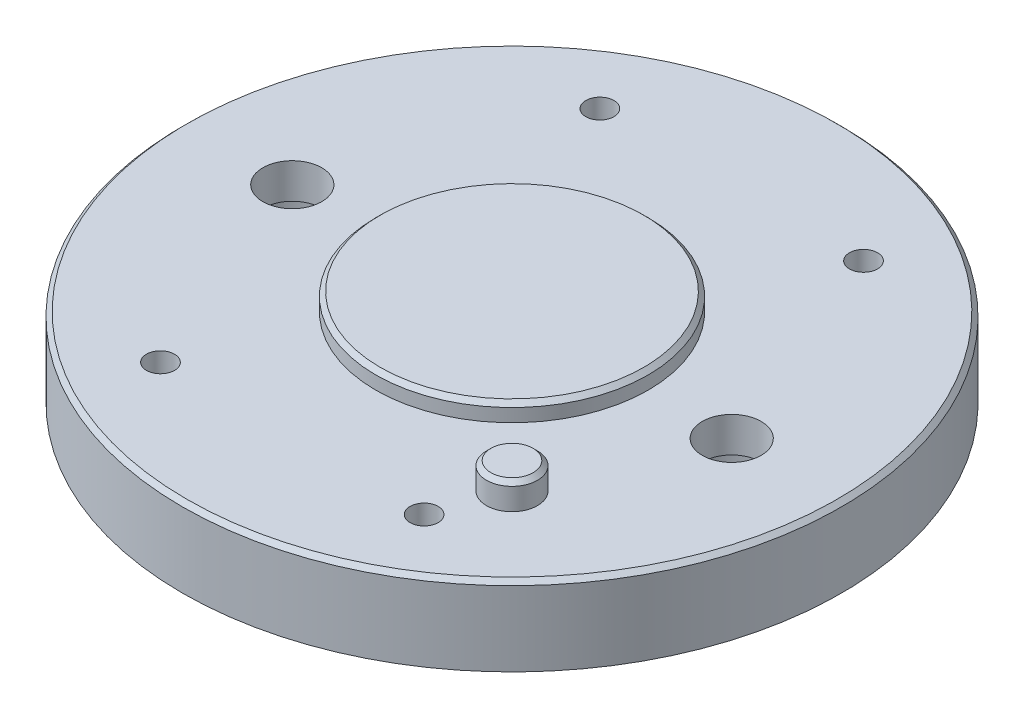
ISO-10303-21;
HEADER;
FILE_DESCRIPTION(('STEP AP214'),'2;1');
FILE_NAME('part.step','',(''),(''),'','','');
FILE_SCHEMA(('AUTOMOTIVE_DESIGN { 1 0 10303 214 1 1 1 1 }'));
ENDSEC;
DATA;
#1=APPLICATION_CONTEXT('core data for automotive mechanical design processes');
#2=APPLICATION_PROTOCOL_DEFINITION('international standard','automotive_design',2000,#1);
#3=PRODUCT_CONTEXT('',#1,'mechanical');
#4=PRODUCT('Part','Part','',(#3));
#5=PRODUCT_RELATED_PRODUCT_CATEGORY('part','',(#4));
#6=PRODUCT_DEFINITION_FORMATION('','',#4);
#7=PRODUCT_DEFINITION_CONTEXT('part definition',#1,'design');
#8=PRODUCT_DEFINITION('design','',#6,#7);
#9=PRODUCT_DEFINITION_SHAPE('','',#8);
#10=(LENGTH_UNIT() NAMED_UNIT(*) SI_UNIT(.MILLI.,.METRE.));
#11=(NAMED_UNIT(*) PLANE_ANGLE_UNIT() SI_UNIT($,.RADIAN.));
#12=(NAMED_UNIT(*) SI_UNIT($,.STERADIAN.) SOLID_ANGLE_UNIT());
#13=UNCERTAINTY_MEASURE_WITH_UNIT(LENGTH_MEASURE(1.E-05),#10,'distance_accuracy_value','');
#14=(GEOMETRIC_REPRESENTATION_CONTEXT(3) GLOBAL_UNCERTAINTY_ASSIGNED_CONTEXT((#13)) GLOBAL_UNIT_ASSIGNED_CONTEXT((#10,
#11,#12)) REPRESENTATION_CONTEXT('',''));
#15=CARTESIAN_POINT('',(0.,0.,0.));
#16=DIRECTION('',(0.,0.,1.));
#17=DIRECTION('',(1.,0.,0.));
#18=AXIS2_PLACEMENT_3D('',#15,#16,#17);
#19=CARTESIAN_POINT('',(0.,9.,0.));
#20=DIRECTION('',(0.,1.,0.));
#21=DIRECTION('',(0.,0.,1.));
#22=AXIS2_PLACEMENT_3D('',#19,#20,#21);
#23=PLANE('',#22);
#24=CARTESIAN_POINT('',(17.6776695296637,9.,17.6776695296637));
#25=DIRECTION('',(0.,1.,0.));
#26=DIRECTION('',(0.,0.,1.));
#27=AXIS2_PLACEMENT_3D('',#24,#25,#26);
#28=CIRCLE('',#27,2.9);
#29=CARTESIAN_POINT('',(17.6776695296637,9.,20.5776695296637));
#30=VERTEX_POINT('',#29);
#31=EDGE_CURVE('E138',#30,#30,#28,.T.);
#32=ORIENTED_EDGE('',*,*,#31,.F.);
#33=EDGE_LOOP('',(#32));
#34=FACE_BOUND('',#33,.T.);
#35=CARTESIAN_POINT('',(0.,9.,0.));
#36=DIRECTION('',(0.,1.,0.));
#37=DIRECTION('',(0.,0.,1.));
#38=AXIS2_PLACEMENT_3D('',#35,#36,#37);
#39=CIRCLE('',#38,37.);
#40=CARTESIAN_POINT('',(0.,9.,37.));
#41=VERTEX_POINT('',#40);
#42=EDGE_CURVE('E58',#41,#41,#39,.T.);
#43=ORIENTED_EDGE('',*,*,#42,.T.);
#44=EDGE_LOOP('',(#43));
#45=FACE_BOUND('',#44,.T.);
#46=CARTESIAN_POINT('',(15.,9.,25.));
#47=DIRECTION('',(0.,1.,0.));
#48=DIRECTION('',(0.,0.,1.));
#49=AXIS2_PLACEMENT_3D('',#46,#47,#48);
#50=CIRCLE('',#49,1.6);
#51=CARTESIAN_POINT('',(15.,9.,26.6));
#52=VERTEX_POINT('',#51);
#53=EDGE_CURVE('E112',#52,#52,#50,.T.);
#54=ORIENTED_EDGE('',*,*,#53,.F.);
#55=EDGE_LOOP('',(#54));
#56=FACE_BOUND('',#55,.T.);
#57=CARTESIAN_POINT('',(-15.,9.,25.));
#58=DIRECTION('',(0.,1.,0.));
#59=DIRECTION('',(0.,0.,1.));
#60=AXIS2_PLACEMENT_3D('',#57,#58,#59);
#61=CIRCLE('',#60,1.6);
#62=CARTESIAN_POINT('',(-15.,9.,26.6));
#63=VERTEX_POINT('',#62);
#64=EDGE_CURVE('E116',#63,#63,#61,.T.);
#65=ORIENTED_EDGE('',*,*,#64,.F.);
#66=EDGE_LOOP('',(#65));
#67=FACE_BOUND('',#66,.T.);
#68=CARTESIAN_POINT('',(-15.,9.,-25.));
#69=DIRECTION('',(0.,1.,0.));
#70=DIRECTION('',(0.,0.,1.));
#71=AXIS2_PLACEMENT_3D('',#68,#69,#70);
#72=CIRCLE('',#71,1.6);
#73=CARTESIAN_POINT('',(-15.,9.,-23.4));
#74=VERTEX_POINT('',#73);
#75=EDGE_CURVE('E120',#74,#74,#72,.T.);
#76=ORIENTED_EDGE('',*,*,#75,.F.);
#77=EDGE_LOOP('',(#76));
#78=FACE_BOUND('',#77,.T.);
#79=CARTESIAN_POINT('',(15.,9.,-25.));
#80=DIRECTION('',(0.,1.,0.));
#81=DIRECTION('',(0.,0.,1.));
#82=AXIS2_PLACEMENT_3D('',#79,#80,#81);
#83=CIRCLE('',#82,1.6);
#84=CARTESIAN_POINT('',(15.,9.,-23.4));
#85=VERTEX_POINT('',#84);
#86=EDGE_CURVE('E124',#85,#85,#83,.T.);
#87=ORIENTED_EDGE('',*,*,#86,.F.);
#88=EDGE_LOOP('',(#87));
#89=FACE_BOUND('',#88,.T.);
#90=CARTESIAN_POINT('',(0.,9.,0.));
#91=DIRECTION('',(0.,1.,0.));
#92=DIRECTION('',(0.,0.,1.));
#93=AXIS2_PLACEMENT_3D('',#90,#91,#92);
#94=CIRCLE('',#93,15.5);
#95=CARTESIAN_POINT('',(0.,9.,15.5));
#96=VERTEX_POINT('',#95);
#97=EDGE_CURVE('E108',#96,#96,#94,.T.);
#98=ORIENTED_EDGE('',*,*,#97,.F.);
#99=EDGE_LOOP('',(#98));
#100=FACE_BOUND('',#99,.T.);
#101=CARTESIAN_POINT('',(25.,9.,0.));
#102=DIRECTION('',(0.,-1.,0.));
#103=DIRECTION('',(0.,0.,-1.));
#104=AXIS2_PLACEMENT_3D('',#101,#102,#103);
#105=CIRCLE('',#104,3.35000000000001);
#106=CARTESIAN_POINT('',(25.,9.,-3.35000000000001));
#107=VERTEX_POINT('',#106);
#108=EDGE_CURVE('E92',#107,#107,#105,.T.);
#109=ORIENTED_EDGE('',*,*,#108,.T.);
#110=EDGE_LOOP('',(#109));
#111=FACE_BOUND('',#110,.T.);
#112=CARTESIAN_POINT('',(-25.,9.,0.));
#113=DIRECTION('',(0.,-1.,0.));
#114=DIRECTION('',(0.,0.,-1.));
#115=AXIS2_PLACEMENT_3D('',#112,#113,#114);
#116=CIRCLE('',#115,3.35000000000001);
#117=CARTESIAN_POINT('',(-25.,9.,-3.35000000000001));
#118=VERTEX_POINT('',#117);
#119=EDGE_CURVE('E76',#118,#118,#116,.T.);
#120=ORIENTED_EDGE('',*,*,#119,.T.);
#121=EDGE_LOOP('',(#120));
#122=FACE_BOUND('',#121,.T.);
#123=ADVANCED_FACE('F39',(#34,#45,#56,#67,#78,#89,#100,#111,#122),#23,.T.);
#124=CARTESIAN_POINT('',(0.,0.,0.));
#125=DIRECTION('',(0.,1.,0.));
#126=DIRECTION('',(0.,0.,1.));
#127=AXIS2_PLACEMENT_3D('',#124,#125,#126);
#128=PLANE('',#127);
#129=CARTESIAN_POINT('',(15.,0.,25.));
#130=DIRECTION('',(0.,-1.,0.));
#131=DIRECTION('',(0.,0.,-1.));
#132=AXIS2_PLACEMENT_3D('',#129,#130,#131);
#133=CIRCLE('',#132,1.6);
#134=CARTESIAN_POINT('',(15.,0.,23.4));
#135=VERTEX_POINT('',#134);
#136=EDGE_CURVE('E133',#135,#135,#133,.T.);
#137=ORIENTED_EDGE('',*,*,#136,.F.);
#138=EDGE_LOOP('',(#137));
#139=FACE_BOUND('',#138,.T.);
#140=CARTESIAN_POINT('',(-15.,0.,25.));
#141=DIRECTION('',(0.,-1.,0.));
#142=DIRECTION('',(0.,0.,-1.));
#143=AXIS2_PLACEMENT_3D('',#140,#141,#142);
#144=CIRCLE('',#143,1.6);
#145=CARTESIAN_POINT('',(-15.,0.,23.4));
#146=VERTEX_POINT('',#145);
#147=EDGE_CURVE('E137',#146,#146,#144,.T.);
#148=ORIENTED_EDGE('',*,*,#147,.F.);
#149=EDGE_LOOP('',(#148));
#150=FACE_BOUND('',#149,.T.);
#151=CARTESIAN_POINT('',(-15.,0.,-25.));
#152=DIRECTION('',(0.,-1.,0.));
#153=DIRECTION('',(0.,0.,-1.));
#154=AXIS2_PLACEMENT_3D('',#151,#152,#153);
#155=CIRCLE('',#154,1.6);
#156=CARTESIAN_POINT('',(-15.,0.,-26.6));
#157=VERTEX_POINT('',#156);
#158=EDGE_CURVE('E132',#157,#157,#155,.T.);
#159=ORIENTED_EDGE('',*,*,#158,.F.);
#160=EDGE_LOOP('',(#159));
#161=FACE_BOUND('',#160,.T.);
#162=CARTESIAN_POINT('',(15.,0.,-25.));
#163=DIRECTION('',(0.,-1.,0.));
#164=DIRECTION('',(0.,0.,-1.));
#165=AXIS2_PLACEMENT_3D('',#162,#163,#164);
#166=CIRCLE('',#165,1.6);
#167=CARTESIAN_POINT('',(15.,0.,-26.6));
#168=VERTEX_POINT('',#167);
#169=EDGE_CURVE('E128',#168,#168,#166,.T.);
#170=ORIENTED_EDGE('',*,*,#169,.F.);
#171=EDGE_LOOP('',(#170));
#172=FACE_BOUND('',#171,.T.);
#173=CARTESIAN_POINT('',(25.,0.,0.));
#174=DIRECTION('',(0.,-1.,0.));
#175=DIRECTION('',(0.,0.,-1.));
#176=AXIS2_PLACEMENT_3D('',#173,#174,#175);
#177=CIRCLE('',#176,5.55000000000001);
#178=CARTESIAN_POINT('',(25.,0.,-5.55000000000001));
#179=VERTEX_POINT('',#178);
#180=EDGE_CURVE('E104',#179,#179,#177,.T.);
#181=ORIENTED_EDGE('',*,*,#180,.F.);
#182=EDGE_LOOP('',(#181));
#183=FACE_BOUND('',#182,.T.);
#184=CARTESIAN_POINT('',(-25.,0.,0.));
#185=DIRECTION('',(0.,-1.,0.));
#186=DIRECTION('',(0.,0.,-1.));
#187=AXIS2_PLACEMENT_3D('',#184,#185,#186);
#188=CIRCLE('',#187,5.55000000000001);
#189=CARTESIAN_POINT('',(-25.,0.,-5.55000000000001));
#190=VERTEX_POINT('',#189);
#191=EDGE_CURVE('E88',#190,#190,#188,.T.);
#192=ORIENTED_EDGE('',*,*,#191,.F.);
#193=EDGE_LOOP('',(#192));
#194=FACE_BOUND('',#193,.T.);
#195=CARTESIAN_POINT('',(0.,0.,0.));
#196=DIRECTION('',(0.,1.,0.));
#197=DIRECTION('',(0.,0.,1.));
#198=AXIS2_PLACEMENT_3D('',#195,#196,#197);
#199=CIRCLE('',#198,37.5);
#200=CARTESIAN_POINT('',(0.,0.,37.5));
#201=VERTEX_POINT('',#200);
#202=EDGE_CURVE('E72',#201,#201,#199,.T.);
#203=ORIENTED_EDGE('',*,*,#202,.F.);
#204=EDGE_LOOP('',(#203));
#205=FACE_BOUND('',#204,.T.);
#206=ADVANCED_FACE('F153',(#139,#150,#161,#172,#183,#194,#205),#128,.F.);
#207=CARTESIAN_POINT('',(0.,9.,0.));
#208=DIRECTION('',(0.,-1.,0.));
#209=DIRECTION('',(0.,0.,-1.));
#210=AXIS2_PLACEMENT_3D('',#207,#208,#209);
#211=CYLINDRICAL_SURFACE('',#210,37.5);
#212=CARTESIAN_POINT('',(0.,8.49999999999999,0.));
#213=DIRECTION('',(0.,1.,0.));
#214=DIRECTION('',(0.,0.,1.));
#215=AXIS2_PLACEMENT_3D('',#212,#213,#214);
#216=CIRCLE('',#215,37.5);
#217=CARTESIAN_POINT('',(0.,8.49999999999999,37.5));
#218=VERTEX_POINT('',#217);
#219=EDGE_CURVE('E53',#218,#218,#216,.F.);
#220=ORIENTED_EDGE('',*,*,#219,.T.);
#221=EDGE_LOOP('',(#220));
#222=FACE_BOUND('',#221,.T.);
#223=ORIENTED_EDGE('',*,*,#202,.T.);
#224=EDGE_LOOP('',(#223));
#225=FACE_BOUND('',#224,.T.);
#226=ADVANCED_FACE('F175',(#222,#225),#211,.T.);
#227=CARTESIAN_POINT('',(-25.,0.,0.));
#228=DIRECTION('',(0.,-1.,0.));
#229=DIRECTION('',(0.,0.,-1.));
#230=AXIS2_PLACEMENT_3D('',#227,#228,#229);
#231=CYLINDRICAL_SURFACE('',#230,3.35000000000001);
#232=ORIENTED_EDGE('',*,*,#119,.F.);
#233=EDGE_LOOP('',(#232));
#234=FACE_BOUND('',#233,.T.);
#235=CARTESIAN_POINT('',(-25.,5.,0.));
#236=DIRECTION('',(0.,-1.,0.));
#237=DIRECTION('',(0.,0.,-1.));
#238=AXIS2_PLACEMENT_3D('',#235,#236,#237);
#239=CIRCLE('',#238,3.35000000000001);
#240=CARTESIAN_POINT('',(-25.,5.,-3.35000000000001));
#241=VERTEX_POINT('',#240);
#242=EDGE_CURVE('E80',#241,#241,#239,.T.);
#243=ORIENTED_EDGE('',*,*,#242,.T.);
#244=EDGE_LOOP('',(#243));
#245=FACE_BOUND('',#244,.T.);
#246=ADVANCED_FACE('F171',(#234,#245),#231,.F.);
#247=CARTESIAN_POINT('',(-21.65,5.,0.));
#248=DIRECTION('',(0.,1.,0.));
#249=DIRECTION('',(0.,0.,1.));
#250=AXIS2_PLACEMENT_3D('',#247,#248,#249);
#251=PLANE('',#250);
#252=ORIENTED_EDGE('',*,*,#242,.F.);
#253=EDGE_LOOP('',(#252));
#254=FACE_BOUND('',#253,.T.);
#255=CARTESIAN_POINT('',(-25.,5.,0.));
#256=DIRECTION('',(0.,-1.,0.));
#257=DIRECTION('',(0.,0.,-1.));
#258=AXIS2_PLACEMENT_3D('',#255,#256,#257);
#259=CIRCLE('',#258,5.55000000000001);
#260=CARTESIAN_POINT('',(-25.,5.,-5.55000000000001));
#261=VERTEX_POINT('',#260);
#262=EDGE_CURVE('E84',#261,#261,#259,.T.);
#263=ORIENTED_EDGE('',*,*,#262,.T.);
#264=EDGE_LOOP('',(#263));
#265=FACE_BOUND('',#264,.T.);
#266=ADVANCED_FACE('F174',(#254,#265),#251,.F.);
#267=CARTESIAN_POINT('',(-25.,0.,0.));
#268=DIRECTION('',(0.,-1.,0.));
#269=DIRECTION('',(0.,0.,-1.));
#270=AXIS2_PLACEMENT_3D('',#267,#268,#269);
#271=CYLINDRICAL_SURFACE('',#270,5.55000000000001);
#272=ORIENTED_EDGE('',*,*,#262,.F.);
#273=EDGE_LOOP('',(#272));
#274=FACE_BOUND('',#273,.T.);
#275=ORIENTED_EDGE('',*,*,#191,.T.);
#276=EDGE_LOOP('',(#275));
#277=FACE_BOUND('',#276,.T.);
#278=ADVANCED_FACE('F181',(#274,#277),#271,.F.);
#279=CARTESIAN_POINT('',(25.,0.,0.));
#280=DIRECTION('',(0.,-1.,0.));
#281=DIRECTION('',(0.,0.,-1.));
#282=AXIS2_PLACEMENT_3D('',#279,#280,#281);
#283=CYLINDRICAL_SURFACE('',#282,3.35000000000001);
#284=ORIENTED_EDGE('',*,*,#108,.F.);
#285=EDGE_LOOP('',(#284));
#286=FACE_BOUND('',#285,.T.);
#287=CARTESIAN_POINT('',(25.,5.,0.));
#288=DIRECTION('',(0.,-1.,0.));
#289=DIRECTION('',(0.,0.,-1.));
#290=AXIS2_PLACEMENT_3D('',#287,#288,#289);
#291=CIRCLE('',#290,3.35000000000001);
#292=CARTESIAN_POINT('',(25.,5.,-3.35000000000001));
#293=VERTEX_POINT('',#292);
#294=EDGE_CURVE('E96',#293,#293,#291,.T.);
#295=ORIENTED_EDGE('',*,*,#294,.T.);
#296=EDGE_LOOP('',(#295));
#297=FACE_BOUND('',#296,.T.);
#298=ADVANCED_FACE('F187',(#286,#297),#283,.F.);
#299=CARTESIAN_POINT('',(28.35,5.,0.));
#300=DIRECTION('',(0.,1.,0.));
#301=DIRECTION('',(0.,0.,1.));
#302=AXIS2_PLACEMENT_3D('',#299,#300,#301);
#303=PLANE('',#302);
#304=ORIENTED_EDGE('',*,*,#294,.F.);
#305=EDGE_LOOP('',(#304));
#306=FACE_BOUND('',#305,.T.);
#307=CARTESIAN_POINT('',(25.,5.,0.));
#308=DIRECTION('',(0.,-1.,0.));
#309=DIRECTION('',(0.,0.,-1.));
#310=AXIS2_PLACEMENT_3D('',#307,#308,#309);
#311=CIRCLE('',#310,5.55000000000001);
#312=CARTESIAN_POINT('',(25.,5.,-5.55000000000001));
#313=VERTEX_POINT('',#312);
#314=EDGE_CURVE('E100',#313,#313,#311,.T.);
#315=ORIENTED_EDGE('',*,*,#314,.T.);
#316=EDGE_LOOP('',(#315));
#317=FACE_BOUND('',#316,.T.);
#318=ADVANCED_FACE('F251',(#306,#317),#303,.F.);
#319=CARTESIAN_POINT('',(25.,0.,0.));
#320=DIRECTION('',(0.,-1.,0.));
#321=DIRECTION('',(0.,0.,-1.));
#322=AXIS2_PLACEMENT_3D('',#319,#320,#321);
#323=CYLINDRICAL_SURFACE('',#322,5.55000000000001);
#324=ORIENTED_EDGE('',*,*,#314,.F.);
#325=EDGE_LOOP('',(#324));
#326=FACE_BOUND('',#325,.T.);
#327=ORIENTED_EDGE('',*,*,#180,.T.);
#328=EDGE_LOOP('',(#327));
#329=FACE_BOUND('',#328,.T.);
#330=ADVANCED_FACE('F247',(#326,#329),#323,.F.);
#331=CARTESIAN_POINT('',(0.,11.,0.));
#332=DIRECTION('',(0.,-1.,0.));
#333=DIRECTION('',(0.,0.,-1.));
#334=AXIS2_PLACEMENT_3D('',#331,#332,#333);
#335=CYLINDRICAL_SURFACE('',#334,15.5);
#336=CARTESIAN_POINT('',(0.,10.5,0.));
#337=DIRECTION('',(0.,1.,0.));
#338=DIRECTION('',(0.,0.,1.));
#339=AXIS2_PLACEMENT_3D('',#336,#337,#338);
#340=CIRCLE('',#339,15.5);
#341=CARTESIAN_POINT('',(0.,10.5,15.5));
#342=VERTEX_POINT('',#341);
#343=EDGE_CURVE('E64',#342,#342,#340,.F.);
#344=ORIENTED_EDGE('',*,*,#343,.T.);
#345=EDGE_LOOP('',(#344));
#346=FACE_BOUND('',#345,.T.);
#347=ORIENTED_EDGE('',*,*,#97,.T.);
#348=EDGE_LOOP('',(#347));
#349=FACE_BOUND('',#348,.T.);
#350=ADVANCED_FACE('F243',(#346,#349),#335,.T.);
#351=CARTESIAN_POINT('',(0.,11.,0.));
#352=DIRECTION('',(0.,1.,0.));
#353=DIRECTION('',(0.,0.,1.));
#354=AXIS2_PLACEMENT_3D('',#351,#352,#353);
#355=PLANE('',#354);
#356=CARTESIAN_POINT('',(0.,11.,0.));
#357=DIRECTION('',(0.,1.,0.));
#358=DIRECTION('',(0.,0.,1.));
#359=AXIS2_PLACEMENT_3D('',#356,#357,#358);
#360=CIRCLE('',#359,15.);
#361=CARTESIAN_POINT('',(0.,11.,15.));
#362=VERTEX_POINT('',#361);
#363=EDGE_CURVE('E68',#362,#362,#360,.T.);
#364=ORIENTED_EDGE('',*,*,#363,.T.);
#365=EDGE_LOOP('',(#364));
#366=FACE_BOUND('',#365,.T.);
#367=ADVANCED_FACE('F210',(#366),#355,.T.);
#368=CARTESIAN_POINT('',(0.,11.,0.));
#369=DIRECTION('',(0.,-1.,0.));
#370=DIRECTION('',(0.,0.,-1.));
#371=AXIS2_PLACEMENT_3D('',#368,#369,#370);
#372=CONICAL_SURFACE('',#371,15.,0.78539816339745);
#373=ORIENTED_EDGE('',*,*,#343,.F.);
#374=EDGE_LOOP('',(#373));
#375=FACE_BOUND('',#374,.T.);
#376=ORIENTED_EDGE('',*,*,#363,.F.);
#377=EDGE_LOOP('',(#376));
#378=FACE_BOUND('',#377,.T.);
#379=ADVANCED_FACE('F204',(#375,#378),#372,.T.);
#380=CARTESIAN_POINT('',(15.,11.,-25.));
#381=DIRECTION('',(0.,-1.,0.));
#382=DIRECTION('',(0.,0.,-1.));
#383=AXIS2_PLACEMENT_3D('',#380,#381,#382);
#384=CYLINDRICAL_SURFACE('',#383,1.6);
#385=ORIENTED_EDGE('',*,*,#86,.T.);
#386=EDGE_LOOP('',(#385));
#387=FACE_BOUND('',#386,.T.);
#388=ORIENTED_EDGE('',*,*,#169,.T.);
#389=EDGE_LOOP('',(#388));
#390=FACE_BOUND('',#389,.T.);
#391=ADVANCED_FACE('F209',(#387,#390),#384,.F.);
#392=CARTESIAN_POINT('',(-15.,11.,-25.));
#393=DIRECTION('',(0.,-1.,0.));
#394=DIRECTION('',(0.,0.,-1.));
#395=AXIS2_PLACEMENT_3D('',#392,#393,#394);
#396=CYLINDRICAL_SURFACE('',#395,1.6);
#397=ORIENTED_EDGE('',*,*,#75,.T.);
#398=EDGE_LOOP('',(#397));
#399=FACE_BOUND('',#398,.T.);
#400=ORIENTED_EDGE('',*,*,#158,.T.);
#401=EDGE_LOOP('',(#400));
#402=FACE_BOUND('',#401,.T.);
#403=ADVANCED_FACE('F232',(#399,#402),#396,.F.);
#404=CARTESIAN_POINT('',(-15.,11.,25.));
#405=DIRECTION('',(0.,-1.,0.));
#406=DIRECTION('',(0.,0.,-1.));
#407=AXIS2_PLACEMENT_3D('',#404,#405,#406);
#408=CYLINDRICAL_SURFACE('',#407,1.6);
#409=ORIENTED_EDGE('',*,*,#64,.T.);
#410=EDGE_LOOP('',(#409));
#411=FACE_BOUND('',#410,.T.);
#412=ORIENTED_EDGE('',*,*,#147,.T.);
#413=EDGE_LOOP('',(#412));
#414=FACE_BOUND('',#413,.T.);
#415=ADVANCED_FACE('F224',(#411,#414),#408,.F.);
#416=CARTESIAN_POINT('',(15.,11.,25.));
#417=DIRECTION('',(0.,-1.,0.));
#418=DIRECTION('',(0.,0.,-1.));
#419=AXIS2_PLACEMENT_3D('',#416,#417,#418);
#420=CYLINDRICAL_SURFACE('',#419,1.6);
#421=ORIENTED_EDGE('',*,*,#53,.T.);
#422=EDGE_LOOP('',(#421));
#423=FACE_BOUND('',#422,.T.);
#424=ORIENTED_EDGE('',*,*,#136,.T.);
#425=EDGE_LOOP('',(#424));
#426=FACE_BOUND('',#425,.T.);
#427=ADVANCED_FACE('F216',(#423,#426),#420,.F.);
#428=CARTESIAN_POINT('',(0.,9.,0.));
#429=DIRECTION('',(0.,-1.,0.));
#430=DIRECTION('',(0.,0.,-1.));
#431=AXIS2_PLACEMENT_3D('',#428,#429,#430);
#432=CONICAL_SURFACE('',#431,37.,0.785398163397455);
#433=ORIENTED_EDGE('',*,*,#219,.F.);
#434=EDGE_LOOP('',(#433));
#435=FACE_BOUND('',#434,.T.);
#436=ORIENTED_EDGE('',*,*,#42,.F.);
#437=EDGE_LOOP('',(#436));
#438=FACE_BOUND('',#437,.T.);
#439=ADVANCED_FACE('F212',(#435,#438),#432,.T.);
#440=CARTESIAN_POINT('',(17.6776695296637,12.,17.6776695296637));
#441=DIRECTION('',(0.,-1.,0.));
#442=DIRECTION('',(0.,0.,-1.));
#443=AXIS2_PLACEMENT_3D('',#440,#441,#442);
#444=CYLINDRICAL_SURFACE('',#443,2.9);
#445=CARTESIAN_POINT('',(17.6776695296637,11.5,17.6776695296637));
#446=DIRECTION('',(0.,1.,0.));
#447=DIRECTION('',(0.,0.,1.));
#448=AXIS2_PLACEMENT_3D('',#445,#446,#447);
#449=CIRCLE('',#448,2.9);
#450=CARTESIAN_POINT('',(17.6776695296637,11.5,20.5776695296637));
#451=VERTEX_POINT('',#450);
#452=EDGE_CURVE('E10',#451,#451,#449,.F.);
#453=ORIENTED_EDGE('',*,*,#452,.T.);
#454=EDGE_LOOP('',(#453));
#455=FACE_BOUND('',#454,.T.);
#456=ORIENTED_EDGE('',*,*,#31,.T.);
#457=EDGE_LOOP('',(#456));
#458=FACE_BOUND('',#457,.T.);
#459=ADVANCED_FACE('F149',(#455,#458),#444,.T.);
#460=CARTESIAN_POINT('',(17.6776695296637,12.,17.6776695296637));
#461=DIRECTION('',(0.,1.,0.));
#462=DIRECTION('',(0.,0.,1.));
#463=AXIS2_PLACEMENT_3D('',#460,#461,#462);
#464=PLANE('',#463);
#465=CARTESIAN_POINT('',(17.6776695296637,12.,17.6776695296637));
#466=DIRECTION('',(0.,1.,0.));
#467=DIRECTION('',(0.,0.,1.));
#468=AXIS2_PLACEMENT_3D('',#465,#466,#467);
#469=CIRCLE('',#468,2.40000000000001);
#470=CARTESIAN_POINT('',(17.6776695296637,12.,20.0776695296637));
#471=VERTEX_POINT('',#470);
#472=EDGE_CURVE('E48',#471,#471,#469,.T.);
#473=ORIENTED_EDGE('',*,*,#472,.T.);
#474=EDGE_LOOP('',(#473));
#475=FACE_BOUND('',#474,.T.);
#476=ADVANCED_FACE('F222',(#475),#464,.T.);
#477=CARTESIAN_POINT('',(17.6776695296637,12.,17.6776695296637));
#478=DIRECTION('',(0.,-1.,0.));
#479=DIRECTION('',(0.,0.,-1.));
#480=AXIS2_PLACEMENT_3D('',#477,#478,#479);
#481=CONICAL_SURFACE('',#480,2.40000000000001,0.785398163397438);
#482=ORIENTED_EDGE('',*,*,#452,.F.);
#483=EDGE_LOOP('',(#482));
#484=FACE_BOUND('',#483,.T.);
#485=ORIENTED_EDGE('',*,*,#472,.F.);
#486=EDGE_LOOP('',(#485));
#487=FACE_BOUND('',#486,.T.);
#488=ADVANCED_FACE('F42',(#484,#487),#481,.T.);
#489=CLOSED_SHELL('',(#123,#206,#226,#246,#266,#278,#298,#318,#330,#350,#367,#379,#391,#403,
#415,#427,#439,#459,#476,#488));
#490=MANIFOLD_SOLID_BREP('B2',#489);
#491=ADVANCED_BREP_SHAPE_REPRESENTATION('',(#18,#490),#14);
#492=SHAPE_DEFINITION_REPRESENTATION(#9,#491);
ENDSEC;
END-ISO-10303-21;
